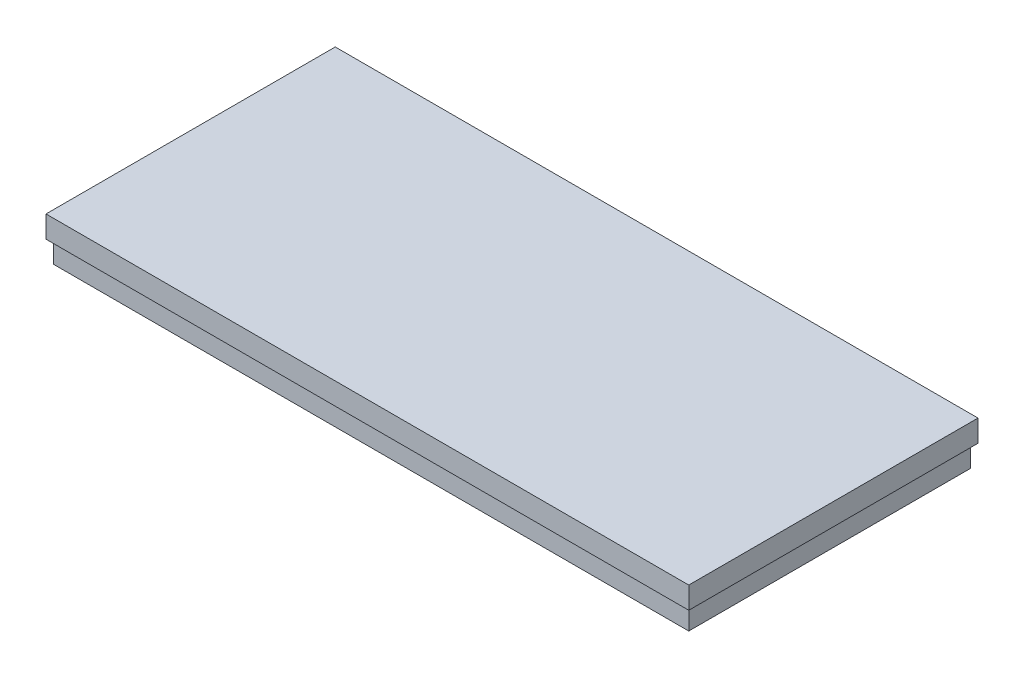
ISO-10303-21;
HEADER;
FILE_DESCRIPTION(('STEP AP214'),'2;1');
FILE_NAME('part.step','',(''),(''),'','','');
FILE_SCHEMA(('AUTOMOTIVE_DESIGN { 1 0 10303 214 1 1 1 1 }'));
ENDSEC;
DATA;
#1=APPLICATION_CONTEXT('core data for automotive mechanical design processes');
#2=APPLICATION_PROTOCOL_DEFINITION('international standard','automotive_design',2000,#1);
#3=PRODUCT_CONTEXT('',#1,'mechanical');
#4=PRODUCT('Part','Part','',(#3));
#5=PRODUCT_RELATED_PRODUCT_CATEGORY('part','',(#4));
#6=PRODUCT_DEFINITION_FORMATION('','',#4);
#7=PRODUCT_DEFINITION_CONTEXT('part definition',#1,'design');
#8=PRODUCT_DEFINITION('design','',#6,#7);
#9=PRODUCT_DEFINITION_SHAPE('','',#8);
#10=(LENGTH_UNIT() NAMED_UNIT(*) SI_UNIT(.MILLI.,.METRE.));
#11=(NAMED_UNIT(*) PLANE_ANGLE_UNIT() SI_UNIT($,.RADIAN.));
#12=(NAMED_UNIT(*) SI_UNIT($,.STERADIAN.) SOLID_ANGLE_UNIT());
#13=UNCERTAINTY_MEASURE_WITH_UNIT(LENGTH_MEASURE(1.E-05),#10,'distance_accuracy_value','');
#14=(GEOMETRIC_REPRESENTATION_CONTEXT(3) GLOBAL_UNCERTAINTY_ASSIGNED_CONTEXT((#13)) GLOBAL_UNIT_ASSIGNED_CONTEXT((#10,
#11,#12)) REPRESENTATION_CONTEXT('',''));
#15=CARTESIAN_POINT('',(0.,0.,0.));
#16=DIRECTION('',(0.,0.,1.));
#17=DIRECTION('',(1.,0.,0.));
#18=AXIS2_PLACEMENT_3D('',#15,#16,#17);
#19=CARTESIAN_POINT('',(198.628511241848,6.79999999999995,46.0225795338821));
#20=DIRECTION('',(-1.,0.,0.));
#21=DIRECTION('',(0.,0.,1.));
#22=AXIS2_PLACEMENT_3D('',#19,#20,#21);
#23=PLANE('',#22);
#24=DIRECTION('',(0.,0.,-1.));
#25=VECTOR('',#24,1.);
#26=CARTESIAN_POINT('',(198.628511241848,0.,46.0225795338821));
#27=LINE('',#26,#25);
#28=CARTESIAN_POINT('',(198.628511241848,0.,133.622579533882));
#29=VERTEX_POINT('',#28);
#30=CARTESIAN_POINT('',(198.628511241848,0.,46.0225795338821));
#31=VERTEX_POINT('',#30);
#32=EDGE_CURVE('E131',#29,#31,#27,.T.);
#33=ORIENTED_EDGE('',*,*,#32,.T.);
#34=DIRECTION('',(0.,-1.,0.));
#35=VECTOR('',#34,1.);
#36=CARTESIAN_POINT('',(198.628511241848,6.79999999999995,46.0225795338821));
#37=LINE('',#36,#35);
#38=CARTESIAN_POINT('',(198.628511241848,6.79999999999995,46.0225795338821));
#39=VERTEX_POINT('',#38);
#40=EDGE_CURVE('E11',#39,#31,#37,.T.);
#41=ORIENTED_EDGE('',*,*,#40,.F.);
#42=DIRECTION('',(0.,0.,-1.));
#43=VECTOR('',#42,1.);
#44=CARTESIAN_POINT('',(198.628511241848,6.79999999999995,46.0225795338821));
#45=LINE('',#44,#43);
#46=CARTESIAN_POINT('',(198.628511241848,6.79999999999995,133.622579533882));
#47=VERTEX_POINT('',#46);
#48=EDGE_CURVE('E140',#47,#39,#45,.T.);
#49=ORIENTED_EDGE('',*,*,#48,.F.);
#50=DIRECTION('',(0.,-1.,0.));
#51=VECTOR('',#50,1.);
#52=CARTESIAN_POINT('',(198.628511241848,6.79999999999995,133.622579533882));
#53=LINE('',#52,#51);
#54=EDGE_CURVE('E149',#47,#29,#53,.T.);
#55=ORIENTED_EDGE('',*,*,#54,.T.);
#56=EDGE_LOOP('',(#33,#41,#49,#55));
#57=FACE_BOUND('',#56,.T.);
#58=ADVANCED_FACE('F33',(#57),#23,.F.);
#59=CARTESIAN_POINT('',(198.628511241848,6.79999999999995,46.0225795338821));
#60=DIRECTION('',(0.,0.,1.));
#61=DIRECTION('',(1.,0.,0.));
#62=AXIS2_PLACEMENT_3D('',#59,#60,#61);
#63=PLANE('',#62);
#64=DIRECTION('',(-1.,0.,0.));
#65=VECTOR('',#64,1.);
#66=CARTESIAN_POINT('',(198.628511241848,0.,46.0225795338821));
#67=LINE('',#66,#65);
#68=CARTESIAN_POINT('',(1.02851124184805,0.,46.0225795338821));
#69=VERTEX_POINT('',#68);
#70=EDGE_CURVE('E134',#31,#69,#67,.T.);
#71=ORIENTED_EDGE('',*,*,#70,.T.);
#72=DIRECTION('',(0.,-1.,0.));
#73=VECTOR('',#72,1.);
#74=CARTESIAN_POINT('',(1.02851124184805,6.79999999999995,46.0225795338821));
#75=LINE('',#74,#73);
#76=CARTESIAN_POINT('',(1.02851124184805,6.79999999999995,46.0225795338821));
#77=VERTEX_POINT('',#76);
#78=EDGE_CURVE('E41',#77,#69,#75,.T.);
#79=ORIENTED_EDGE('',*,*,#78,.F.);
#80=DIRECTION('',(-1.,0.,0.));
#81=VECTOR('',#80,1.);
#82=CARTESIAN_POINT('',(198.628511241848,6.79999999999995,46.0225795338821));
#83=LINE('',#82,#81);
#84=EDGE_CURVE('E75',#39,#77,#83,.T.);
#85=ORIENTED_EDGE('',*,*,#84,.F.);
#86=ORIENTED_EDGE('',*,*,#40,.T.);
#87=EDGE_LOOP('',(#71,#79,#85,#86));
#88=FACE_BOUND('',#87,.T.);
#89=ADVANCED_FACE('F175',(#88),#63,.F.);
#90=CARTESIAN_POINT('',(1.02851124184805,6.79999999999995,46.0225795338821));
#91=DIRECTION('',(1.,0.,0.));
#92=DIRECTION('',(0.,0.,-1.));
#93=AXIS2_PLACEMENT_3D('',#90,#91,#92);
#94=PLANE('',#93);
#95=DIRECTION('',(0.,0.,1.));
#96=VECTOR('',#95,1.);
#97=CARTESIAN_POINT('',(1.02851124184805,0.,46.0225795338821));
#98=LINE('',#97,#96);
#99=CARTESIAN_POINT('',(1.02851124184805,0.,133.622579533882));
#100=VERTEX_POINT('',#99);
#101=EDGE_CURVE('E65',#69,#100,#98,.T.);
#102=ORIENTED_EDGE('',*,*,#101,.T.);
#103=DIRECTION('',(0.,-1.,0.));
#104=VECTOR('',#103,1.);
#105=CARTESIAN_POINT('',(1.02851124184805,6.79999999999995,133.622579533882));
#106=LINE('',#105,#104);
#107=CARTESIAN_POINT('',(1.02851124184805,6.79999999999995,133.622579533882));
#108=VERTEX_POINT('',#107);
#109=EDGE_CURVE('E49',#108,#100,#106,.T.);
#110=ORIENTED_EDGE('',*,*,#109,.F.);
#111=DIRECTION('',(0.,0.,1.));
#112=VECTOR('',#111,1.);
#113=CARTESIAN_POINT('',(1.02851124184805,6.79999999999995,46.0225795338821));
#114=LINE('',#113,#112);
#115=EDGE_CURVE('E144',#77,#108,#114,.T.);
#116=ORIENTED_EDGE('',*,*,#115,.F.);
#117=ORIENTED_EDGE('',*,*,#78,.T.);
#118=EDGE_LOOP('',(#102,#110,#116,#117));
#119=FACE_BOUND('',#118,.T.);
#120=ADVANCED_FACE('F155',(#119),#94,.F.);
#121=CARTESIAN_POINT('',(198.628511241848,6.79999999999995,133.622579533882));
#122=DIRECTION('',(0.,0.,-1.));
#123=DIRECTION('',(-1.,0.,0.));
#124=AXIS2_PLACEMENT_3D('',#121,#122,#123);
#125=PLANE('',#124);
#126=DIRECTION('',(1.,0.,0.));
#127=VECTOR('',#126,1.);
#128=CARTESIAN_POINT('',(198.628511241848,0.,133.622579533882));
#129=LINE('',#128,#127);
#130=EDGE_CURVE('E70',#100,#29,#129,.T.);
#131=ORIENTED_EDGE('',*,*,#130,.T.);
#132=ORIENTED_EDGE('',*,*,#54,.F.);
#133=DIRECTION('',(1.,0.,0.));
#134=VECTOR('',#133,1.);
#135=CARTESIAN_POINT('',(198.628511241848,6.79999999999995,133.622579533882));
#136=LINE('',#135,#134);
#137=EDGE_CURVE('E147',#108,#47,#136,.T.);
#138=ORIENTED_EDGE('',*,*,#137,.F.);
#139=ORIENTED_EDGE('',*,*,#109,.T.);
#140=EDGE_LOOP('',(#131,#132,#138,#139));
#141=FACE_BOUND('',#140,.T.);
#142=ADVANCED_FACE('F160',(#141),#125,.F.);
#143=CARTESIAN_POINT('',(0.,0.,0.));
#144=DIRECTION('',(0.,-1.,0.));
#145=DIRECTION('',(0.,0.,-1.));
#146=AXIS2_PLACEMENT_3D('',#143,#144,#145);
#147=PLANE('',#146);
#148=ORIENTED_EDGE('',*,*,#32,.F.);
#149=ORIENTED_EDGE('',*,*,#130,.F.);
#150=ORIENTED_EDGE('',*,*,#101,.F.);
#151=ORIENTED_EDGE('',*,*,#70,.F.);
#152=EDGE_LOOP('',(#148,#149,#150,#151));
#153=FACE_BOUND('',#152,.T.);
#154=ADVANCED_FACE('F158',(#153),#147,.T.);
#155=CARTESIAN_POINT('',(0.,6.79999999999995,0.));
#156=DIRECTION('',(0.,1.,0.));
#157=DIRECTION('',(0.,0.,1.));
#158=AXIS2_PLACEMENT_3D('',#155,#156,#157);
#159=PLANE('',#158);
#160=DIRECTION('',(0.,0.,-1.));
#161=VECTOR('',#160,1.);
#162=CARTESIAN_POINT('',(199.828511241848,6.79999999999995,44.8225795338821));
#163=LINE('',#162,#161);
#164=CARTESIAN_POINT('',(199.828511241848,6.79999999999995,134.822579533882));
#165=VERTEX_POINT('',#164);
#166=CARTESIAN_POINT('',(199.828511241848,6.79999999999995,44.8225795338821));
#167=VERTEX_POINT('',#166);
#168=EDGE_CURVE('E130',#165,#167,#163,.T.);
#169=ORIENTED_EDGE('',*,*,#168,.F.);
#170=DIRECTION('',(1.,0.,0.));
#171=VECTOR('',#170,1.);
#172=CARTESIAN_POINT('',(-0.17148875815193,6.79999999999995,134.822579533882));
#173=LINE('',#172,#171);
#174=CARTESIAN_POINT('',(-0.17148875815193,6.79999999999995,134.822579533882));
#175=VERTEX_POINT('',#174);
#176=EDGE_CURVE('E126',#175,#165,#173,.T.);
#177=ORIENTED_EDGE('',*,*,#176,.F.);
#178=DIRECTION('',(0.,0.,1.));
#179=VECTOR('',#178,1.);
#180=CARTESIAN_POINT('',(-0.171488758151941,6.79999999999995,44.8225795338821));
#181=LINE('',#180,#179);
#182=CARTESIAN_POINT('',(-0.171488758151941,6.79999999999995,44.8225795338821));
#183=VERTEX_POINT('',#182);
#184=EDGE_CURVE('E202',#183,#175,#181,.T.);
#185=ORIENTED_EDGE('',*,*,#184,.F.);
#186=DIRECTION('',(-1.,0.,0.));
#187=VECTOR('',#186,1.);
#188=CARTESIAN_POINT('',(-0.171488758151941,6.79999999999995,44.8225795338821));
#189=LINE('',#188,#187);
#190=EDGE_CURVE('E205',#167,#183,#189,.T.);
#191=ORIENTED_EDGE('',*,*,#190,.F.);
#192=EDGE_LOOP('',(#169,#177,#185,#191));
#193=FACE_BOUND('',#192,.T.);
#194=ORIENTED_EDGE('',*,*,#137,.T.);
#195=ORIENTED_EDGE('',*,*,#48,.T.);
#196=ORIENTED_EDGE('',*,*,#84,.T.);
#197=ORIENTED_EDGE('',*,*,#115,.T.);
#198=EDGE_LOOP('',(#194,#195,#196,#197));
#199=FACE_BOUND('',#198,.T.);
#200=ADVANCED_FACE('F162',(#193,#199),#159,.F.);
#201=CARTESIAN_POINT('',(199.828511241848,13.5999999999999,44.8225795338821));
#202=DIRECTION('',(-1.,0.,0.));
#203=DIRECTION('',(0.,0.,1.));
#204=AXIS2_PLACEMENT_3D('',#201,#202,#203);
#205=PLANE('',#204);
#206=ORIENTED_EDGE('',*,*,#168,.T.);
#207=DIRECTION('',(0.,-1.,0.));
#208=VECTOR('',#207,1.);
#209=CARTESIAN_POINT('',(199.828511241848,13.5999999999999,44.8225795338821));
#210=LINE('',#209,#208);
#211=CARTESIAN_POINT('',(199.828511241848,13.5999999999999,44.8225795338821));
#212=VERTEX_POINT('',#211);
#213=EDGE_CURVE('E110',#212,#167,#210,.T.);
#214=ORIENTED_EDGE('',*,*,#213,.F.);
#215=DIRECTION('',(0.,0.,-1.));
#216=VECTOR('',#215,1.);
#217=CARTESIAN_POINT('',(199.828511241848,13.5999999999999,44.8225795338821));
#218=LINE('',#217,#216);
#219=CARTESIAN_POINT('',(199.828511241848,13.5999999999999,134.822579533882));
#220=VERTEX_POINT('',#219);
#221=EDGE_CURVE('E117',#220,#212,#218,.T.);
#222=ORIENTED_EDGE('',*,*,#221,.F.);
#223=DIRECTION('',(0.,-1.,0.));
#224=VECTOR('',#223,1.);
#225=CARTESIAN_POINT('',(199.828511241848,13.5999999999999,134.822579533882));
#226=LINE('',#225,#224);
#227=EDGE_CURVE('E199',#220,#165,#226,.T.);
#228=ORIENTED_EDGE('',*,*,#227,.T.);
#229=EDGE_LOOP('',(#206,#214,#222,#228));
#230=FACE_BOUND('',#229,.T.);
#231=ADVANCED_FACE('F128',(#230),#205,.F.);
#232=CARTESIAN_POINT('',(-0.171488758151941,13.5999999999999,44.8225795338821));
#233=DIRECTION('',(0.,0.,1.));
#234=DIRECTION('',(1.,0.,0.));
#235=AXIS2_PLACEMENT_3D('',#232,#233,#234);
#236=PLANE('',#235);
#237=ORIENTED_EDGE('',*,*,#190,.T.);
#238=DIRECTION('',(0.,-1.,0.));
#239=VECTOR('',#238,1.);
#240=CARTESIAN_POINT('',(-0.171488758151941,13.5999999999999,44.8225795338821));
#241=LINE('',#240,#239);
#242=CARTESIAN_POINT('',(-0.171488758151941,13.5999999999999,44.8225795338821));
#243=VERTEX_POINT('',#242);
#244=EDGE_CURVE('E113',#243,#183,#241,.T.);
#245=ORIENTED_EDGE('',*,*,#244,.F.);
#246=DIRECTION('',(-1.,0.,0.));
#247=VECTOR('',#246,1.);
#248=CARTESIAN_POINT('',(-0.171488758151941,13.5999999999999,44.8225795338821));
#249=LINE('',#248,#247);
#250=EDGE_CURVE('E106',#212,#243,#249,.T.);
#251=ORIENTED_EDGE('',*,*,#250,.F.);
#252=ORIENTED_EDGE('',*,*,#213,.T.);
#253=EDGE_LOOP('',(#237,#245,#251,#252));
#254=FACE_BOUND('',#253,.T.);
#255=ADVANCED_FACE('F108',(#254),#236,.F.);
#256=CARTESIAN_POINT('',(-0.171488758151941,13.5999999999999,44.8225795338821));
#257=DIRECTION('',(1.,0.,0.));
#258=DIRECTION('',(0.,0.,-1.));
#259=AXIS2_PLACEMENT_3D('',#256,#257,#258);
#260=PLANE('',#259);
#261=ORIENTED_EDGE('',*,*,#184,.T.);
#262=DIRECTION('',(0.,-1.,0.));
#263=VECTOR('',#262,1.);
#264=CARTESIAN_POINT('',(-0.17148875815193,13.5999999999999,134.822579533882));
#265=LINE('',#264,#263);
#266=CARTESIAN_POINT('',(-0.17148875815193,13.5999999999999,134.822579533882));
#267=VERTEX_POINT('',#266);
#268=EDGE_CURVE('E136',#267,#175,#265,.T.);
#269=ORIENTED_EDGE('',*,*,#268,.F.);
#270=DIRECTION('',(0.,0.,1.));
#271=VECTOR('',#270,1.);
#272=CARTESIAN_POINT('',(-0.171488758151941,13.5999999999999,44.8225795338821));
#273=LINE('',#272,#271);
#274=EDGE_CURVE('E116',#243,#267,#273,.T.);
#275=ORIENTED_EDGE('',*,*,#274,.F.);
#276=ORIENTED_EDGE('',*,*,#244,.T.);
#277=EDGE_LOOP('',(#261,#269,#275,#276));
#278=FACE_BOUND('',#277,.T.);
#279=ADVANCED_FACE('F188',(#278),#260,.F.);
#280=CARTESIAN_POINT('',(-0.17148875815193,13.5999999999999,134.822579533882));
#281=DIRECTION('',(0.,0.,-1.));
#282=DIRECTION('',(-1.,0.,0.));
#283=AXIS2_PLACEMENT_3D('',#280,#281,#282);
#284=PLANE('',#283);
#285=ORIENTED_EDGE('',*,*,#176,.T.);
#286=ORIENTED_EDGE('',*,*,#227,.F.);
#287=DIRECTION('',(1.,0.,0.));
#288=VECTOR('',#287,1.);
#289=CARTESIAN_POINT('',(-0.17148875815193,13.5999999999999,134.822579533882));
#290=LINE('',#289,#288);
#291=EDGE_CURVE('E122',#267,#220,#290,.T.);
#292=ORIENTED_EDGE('',*,*,#291,.F.);
#293=ORIENTED_EDGE('',*,*,#268,.T.);
#294=EDGE_LOOP('',(#285,#286,#292,#293));
#295=FACE_BOUND('',#294,.T.);
#296=ADVANCED_FACE('F190',(#295),#284,.F.);
#297=CARTESIAN_POINT('',(0.,13.5999999999999,0.));
#298=DIRECTION('',(0.,1.,0.));
#299=DIRECTION('',(0.,0.,1.));
#300=AXIS2_PLACEMENT_3D('',#297,#298,#299);
#301=PLANE('',#300);
#302=ORIENTED_EDGE('',*,*,#221,.T.);
#303=ORIENTED_EDGE('',*,*,#250,.T.);
#304=ORIENTED_EDGE('',*,*,#274,.T.);
#305=ORIENTED_EDGE('',*,*,#291,.T.);
#306=EDGE_LOOP('',(#302,#303,#304,#305));
#307=FACE_BOUND('',#306,.T.);
#308=ADVANCED_FACE('F120',(#307),#301,.T.);
#309=CLOSED_SHELL('',(#58,#89,#120,#142,#154,#200,#231,#255,#279,#296,#308));
#310=MANIFOLD_SOLID_BREP('B2',#309);
#311=ADVANCED_BREP_SHAPE_REPRESENTATION('',(#18,#310),#14);
#312=SHAPE_DEFINITION_REPRESENTATION(#9,#311);
ENDSEC;
END-ISO-10303-21;
